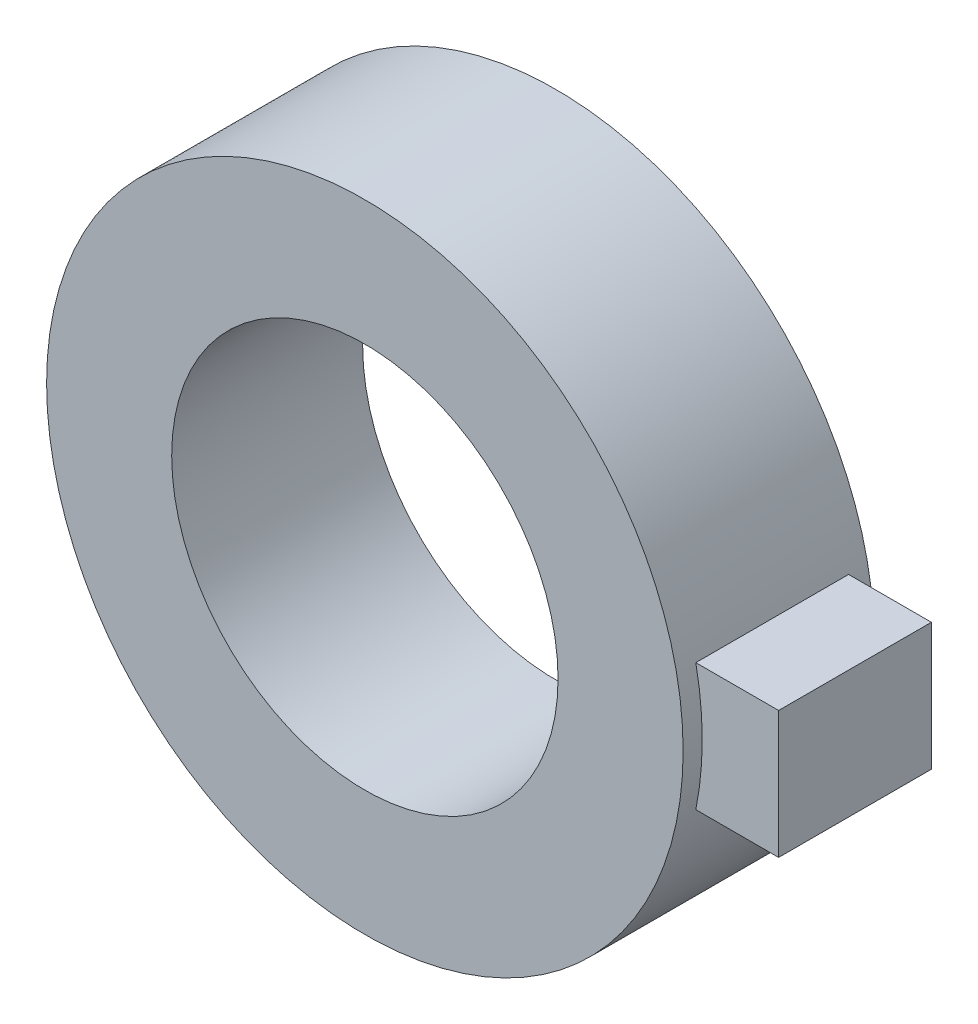
ISO-10303-21;
HEADER;
FILE_DESCRIPTION(('STEP AP214'),'2;1');
FILE_NAME('part.step','',(''),(''),'','','');
FILE_SCHEMA(('AUTOMOTIVE_DESIGN { 1 0 10303 214 1 1 1 1 }'));
ENDSEC;
DATA;
#1=APPLICATION_CONTEXT('core data for automotive mechanical design processes');
#2=APPLICATION_PROTOCOL_DEFINITION('international standard','automotive_design',2000,#1);
#3=PRODUCT_CONTEXT('',#1,'mechanical');
#4=PRODUCT('Part','Part','',(#3));
#5=PRODUCT_RELATED_PRODUCT_CATEGORY('part','',(#4));
#6=PRODUCT_DEFINITION_FORMATION('','',#4);
#7=PRODUCT_DEFINITION_CONTEXT('part definition',#1,'design');
#8=PRODUCT_DEFINITION('design','',#6,#7);
#9=PRODUCT_DEFINITION_SHAPE('','',#8);
#10=(LENGTH_UNIT() NAMED_UNIT(*) SI_UNIT(.MILLI.,.METRE.));
#11=(NAMED_UNIT(*) PLANE_ANGLE_UNIT() SI_UNIT($,.RADIAN.));
#12=(NAMED_UNIT(*) SI_UNIT($,.STERADIAN.) SOLID_ANGLE_UNIT());
#13=UNCERTAINTY_MEASURE_WITH_UNIT(LENGTH_MEASURE(1.E-05),#10,'distance_accuracy_value','');
#14=(GEOMETRIC_REPRESENTATION_CONTEXT(3) GLOBAL_UNCERTAINTY_ASSIGNED_CONTEXT((#13)) GLOBAL_UNIT_ASSIGNED_CONTEXT((#10,
#11,#12)) REPRESENTATION_CONTEXT('',''));
#15=CARTESIAN_POINT('',(0.,0.,0.));
#16=DIRECTION('',(0.,0.,1.));
#17=DIRECTION('',(1.,0.,0.));
#18=AXIS2_PLACEMENT_3D('',#15,#16,#17);
#19=CARTESIAN_POINT('',(46.,-10.,27.));
#20=DIRECTION('',(0.,1.,0.));
#21=DIRECTION('',(0.,0.,1.));
#22=AXIS2_PLACEMENT_3D('',#19,#20,#21);
#23=PLANE('',#22);
#24=DIRECTION('',(0.,0.,-1.));
#25=VECTOR('',#24,1.);
#26=CARTESIAN_POINT('',(48.9897948556636,-10.,30.));
#27=LINE('',#26,#25);
#28=CARTESIAN_POINT('',(48.9897948556636,-10.,3.));
#29=VERTEX_POINT('',#28);
#30=CARTESIAN_POINT('',(48.9897948556636,-10.,27.));
#31=VERTEX_POINT('',#30);
#32=EDGE_CURVE('E95',#29,#31,#27,.F.);
#33=ORIENTED_EDGE('',*,*,#32,.F.);
#34=DIRECTION('',(1.,0.,0.));
#35=VECTOR('',#34,1.);
#36=CARTESIAN_POINT('',(46.,-10.,3.));
#37=LINE('',#36,#35);
#38=CARTESIAN_POINT('',(62.,-10.,3.));
#39=VERTEX_POINT('',#38);
#40=EDGE_CURVE('E82',#29,#39,#37,.T.);
#41=ORIENTED_EDGE('',*,*,#40,.T.);
#42=DIRECTION('',(0.,0.,-1.));
#43=VECTOR('',#42,1.);
#44=CARTESIAN_POINT('',(62.,-10.,27.));
#45=LINE('',#44,#43);
#46=CARTESIAN_POINT('',(62.,-10.,27.));
#47=VERTEX_POINT('',#46);
#48=EDGE_CURVE('E48',#47,#39,#45,.T.);
#49=ORIENTED_EDGE('',*,*,#48,.F.);
#50=DIRECTION('',(1.,0.,0.));
#51=VECTOR('',#50,1.);
#52=CARTESIAN_POINT('',(46.,-10.,27.));
#53=LINE('',#52,#51);
#54=EDGE_CURVE('E91',#31,#47,#53,.T.);
#55=ORIENTED_EDGE('',*,*,#54,.F.);
#56=EDGE_LOOP('',(#33,#41,#49,#55));
#57=FACE_BOUND('',#56,.T.);
#58=ADVANCED_FACE('F41',(#57),#23,.F.);
#59=CARTESIAN_POINT('',(62.,10.,27.));
#60=DIRECTION('',(0.,-1.,0.));
#61=DIRECTION('',(0.,0.,-1.));
#62=AXIS2_PLACEMENT_3D('',#59,#60,#61);
#63=PLANE('',#62);
#64=DIRECTION('',(0.,0.,-1.));
#65=VECTOR('',#64,1.);
#66=CARTESIAN_POINT('',(48.9897948556636,10.,30.));
#67=LINE('',#66,#65);
#68=CARTESIAN_POINT('',(48.9897948556636,10.,27.));
#69=VERTEX_POINT('',#68);
#70=CARTESIAN_POINT('',(48.9897948556636,10.,3.));
#71=VERTEX_POINT('',#70);
#72=EDGE_CURVE('E54',#69,#71,#67,.T.);
#73=ORIENTED_EDGE('',*,*,#72,.F.);
#74=DIRECTION('',(-1.,0.,0.));
#75=VECTOR('',#74,1.);
#76=CARTESIAN_POINT('',(62.,10.,27.));
#77=LINE('',#76,#75);
#78=CARTESIAN_POINT('',(62.,10.,27.));
#79=VERTEX_POINT('',#78);
#80=EDGE_CURVE('E109',#79,#69,#77,.T.);
#81=ORIENTED_EDGE('',*,*,#80,.F.);
#82=DIRECTION('',(0.,0.,-1.));
#83=VECTOR('',#82,1.);
#84=CARTESIAN_POINT('',(62.,10.,27.));
#85=LINE('',#84,#83);
#86=CARTESIAN_POINT('',(62.,10.,3.));
#87=VERTEX_POINT('',#86);
#88=EDGE_CURVE('E112',#79,#87,#85,.T.);
#89=ORIENTED_EDGE('',*,*,#88,.T.);
#90=DIRECTION('',(-1.,0.,0.));
#91=VECTOR('',#90,1.);
#92=CARTESIAN_POINT('',(62.,10.,3.));
#93=LINE('',#92,#91);
#94=EDGE_CURVE('E107',#87,#71,#93,.T.);
#95=ORIENTED_EDGE('',*,*,#94,.T.);
#96=EDGE_LOOP('',(#73,#81,#89,#95));
#97=FACE_BOUND('',#96,.T.);
#98=ADVANCED_FACE('F121',(#97),#63,.F.);
#99=CARTESIAN_POINT('',(62.,-10.,27.));
#100=DIRECTION('',(-1.,0.,0.));
#101=DIRECTION('',(0.,0.,1.));
#102=AXIS2_PLACEMENT_3D('',#99,#100,#101);
#103=PLANE('',#102);
#104=DIRECTION('',(0.,1.,0.));
#105=VECTOR('',#104,1.);
#106=CARTESIAN_POINT('',(62.,-10.,3.));
#107=LINE('',#106,#105);
#108=EDGE_CURVE('E88',#39,#87,#107,.T.);
#109=ORIENTED_EDGE('',*,*,#108,.T.);
#110=ORIENTED_EDGE('',*,*,#88,.F.);
#111=DIRECTION('',(0.,1.,0.));
#112=VECTOR('',#111,1.);
#113=CARTESIAN_POINT('',(62.,-10.,27.));
#114=LINE('',#113,#112);
#115=EDGE_CURVE('E110',#47,#79,#114,.T.);
#116=ORIENTED_EDGE('',*,*,#115,.F.);
#117=ORIENTED_EDGE('',*,*,#48,.T.);
#118=EDGE_LOOP('',(#109,#110,#116,#117));
#119=FACE_BOUND('',#118,.T.);
#120=ADVANCED_FACE('F119',(#119),#103,.F.);
#121=CARTESIAN_POINT('',(0.,0.,27.));
#122=DIRECTION('',(0.,0.,1.));
#123=DIRECTION('',(1.,0.,0.));
#124=AXIS2_PLACEMENT_3D('',#121,#122,#123);
#125=PLANE('',#124);
#126=ORIENTED_EDGE('',*,*,#80,.T.);
#127=CARTESIAN_POINT('',(0.,0.,27.));
#128=DIRECTION('',(0.,0.,1.));
#129=DIRECTION('',(1.,0.,0.));
#130=AXIS2_PLACEMENT_3D('',#127,#128,#129);
#131=CIRCLE('',#130,50.);
#132=EDGE_CURVE('E65',#69,#31,#131,.F.);
#133=ORIENTED_EDGE('',*,*,#132,.T.);
#134=ORIENTED_EDGE('',*,*,#54,.T.);
#135=ORIENTED_EDGE('',*,*,#115,.T.);
#136=EDGE_LOOP('',(#126,#133,#134,#135));
#137=FACE_BOUND('',#136,.T.);
#138=ADVANCED_FACE('F118',(#137),#125,.T.);
#139=CARTESIAN_POINT('',(0.,0.,3.));
#140=DIRECTION('',(0.,0.,1.));
#141=DIRECTION('',(1.,0.,0.));
#142=AXIS2_PLACEMENT_3D('',#139,#140,#141);
#143=PLANE('',#142);
#144=CARTESIAN_POINT('',(0.,0.,3.));
#145=DIRECTION('',(0.,0.,1.));
#146=DIRECTION('',(1.,0.,0.));
#147=AXIS2_PLACEMENT_3D('',#144,#145,#146);
#148=CIRCLE('',#147,50.);
#149=EDGE_CURVE('E11',#71,#29,#148,.F.);
#150=ORIENTED_EDGE('',*,*,#149,.F.);
#151=ORIENTED_EDGE('',*,*,#94,.F.);
#152=ORIENTED_EDGE('',*,*,#108,.F.);
#153=ORIENTED_EDGE('',*,*,#40,.F.);
#154=EDGE_LOOP('',(#150,#151,#152,#153));
#155=FACE_BOUND('',#154,.T.);
#156=ADVANCED_FACE('F83',(#155),#143,.F.);
#157=CARTESIAN_POINT('',(0.,0.,30.));
#158=DIRECTION('',(0.,0.,1.));
#159=DIRECTION('',(1.,0.,0.));
#160=AXIS2_PLACEMENT_3D('',#157,#158,#159);
#161=PLANE('',#160);
#162=CARTESIAN_POINT('',(0.,0.,30.));
#163=DIRECTION('',(0.,0.,1.));
#164=DIRECTION('',(1.,0.,0.));
#165=AXIS2_PLACEMENT_3D('',#162,#163,#164);
#166=CIRCLE('',#165,50.);
#167=CARTESIAN_POINT('',(50.,0.,30.));
#168=VERTEX_POINT('',#167);
#169=EDGE_CURVE('E98',#168,#168,#166,.T.);
#170=ORIENTED_EDGE('',*,*,#169,.T.);
#171=EDGE_LOOP('',(#170));
#172=FACE_BOUND('',#171,.T.);
#173=CARTESIAN_POINT('',(0.,0.,30.));
#174=DIRECTION('',(0.,0.,1.));
#175=DIRECTION('',(1.,0.,0.));
#176=AXIS2_PLACEMENT_3D('',#173,#174,#175);
#177=CIRCLE('',#176,30.35);
#178=CARTESIAN_POINT('',(30.35,0.,30.));
#179=VERTEX_POINT('',#178);
#180=EDGE_CURVE('E149',#179,#179,#177,.T.);
#181=ORIENTED_EDGE('',*,*,#180,.F.);
#182=EDGE_LOOP('',(#181));
#183=FACE_BOUND('',#182,.T.);
#184=ADVANCED_FACE('F132',(#172,#183),#161,.T.);
#185=CARTESIAN_POINT('',(0.,0.,0.));
#186=DIRECTION('',(0.,0.,1.));
#187=DIRECTION('',(1.,0.,0.));
#188=AXIS2_PLACEMENT_3D('',#185,#186,#187);
#189=PLANE('',#188);
#190=CARTESIAN_POINT('',(0.,0.,0.));
#191=DIRECTION('',(0.,0.,1.));
#192=DIRECTION('',(1.,0.,0.));
#193=AXIS2_PLACEMENT_3D('',#190,#191,#192);
#194=CIRCLE('',#193,50.);
#195=CARTESIAN_POINT('',(50.,0.,0.));
#196=VERTEX_POINT('',#195);
#197=EDGE_CURVE('E101',#196,#196,#194,.T.);
#198=ORIENTED_EDGE('',*,*,#197,.F.);
#199=EDGE_LOOP('',(#198));
#200=FACE_BOUND('',#199,.T.);
#201=CARTESIAN_POINT('',(0.,0.,0.));
#202=DIRECTION('',(0.,0.,1.));
#203=DIRECTION('',(1.,0.,0.));
#204=AXIS2_PLACEMENT_3D('',#201,#202,#203);
#205=CIRCLE('',#204,30.35);
#206=CARTESIAN_POINT('',(30.35,0.,0.));
#207=VERTEX_POINT('',#206);
#208=EDGE_CURVE('E155',#207,#207,#205,.T.);
#209=ORIENTED_EDGE('',*,*,#208,.T.);
#210=EDGE_LOOP('',(#209));
#211=FACE_BOUND('',#210,.T.);
#212=ADVANCED_FACE('F136',(#200,#211),#189,.F.);
#213=CARTESIAN_POINT('',(0.,0.,30.));
#214=DIRECTION('',(0.,0.,-1.));
#215=DIRECTION('',(-1.,0.,0.));
#216=AXIS2_PLACEMENT_3D('',#213,#214,#215);
#217=CYLINDRICAL_SURFACE('',#216,50.);
#218=ORIENTED_EDGE('',*,*,#132,.F.);
#219=ORIENTED_EDGE('',*,*,#72,.T.);
#220=ORIENTED_EDGE('',*,*,#149,.T.);
#221=ORIENTED_EDGE('',*,*,#32,.T.);
#222=EDGE_LOOP('',(#218,#219,#220,#221));
#223=FACE_BOUND('',#222,.T.);
#224=ORIENTED_EDGE('',*,*,#169,.F.);
#225=EDGE_LOOP('',(#224));
#226=FACE_BOUND('',#225,.T.);
#227=ORIENTED_EDGE('',*,*,#197,.T.);
#228=EDGE_LOOP('',(#227));
#229=FACE_BOUND('',#228,.T.);
#230=ADVANCED_FACE('F96',(#223,#226,#229),#217,.T.);
#231=CARTESIAN_POINT('',(0.,0.,30.));
#232=DIRECTION('',(0.,0.,-1.));
#233=DIRECTION('',(-1.,0.,0.));
#234=AXIS2_PLACEMENT_3D('',#231,#232,#233);
#235=CYLINDRICAL_SURFACE('',#234,30.35);
#236=ORIENTED_EDGE('',*,*,#180,.T.);
#237=EDGE_LOOP('',(#236));
#238=FACE_BOUND('',#237,.T.);
#239=ORIENTED_EDGE('',*,*,#208,.F.);
#240=EDGE_LOOP('',(#239));
#241=FACE_BOUND('',#240,.T.);
#242=ADVANCED_FACE('F133',(#238,#241),#235,.F.);
#243=CLOSED_SHELL('',(#58,#98,#120,#138,#156,#184,#212,#230,#242));
#244=MANIFOLD_SOLID_BREP('B2',#243);
#245=ADVANCED_BREP_SHAPE_REPRESENTATION('',(#18,#244),#14);
#246=SHAPE_DEFINITION_REPRESENTATION(#9,#245);
ENDSEC;
END-ISO-10303-21;
